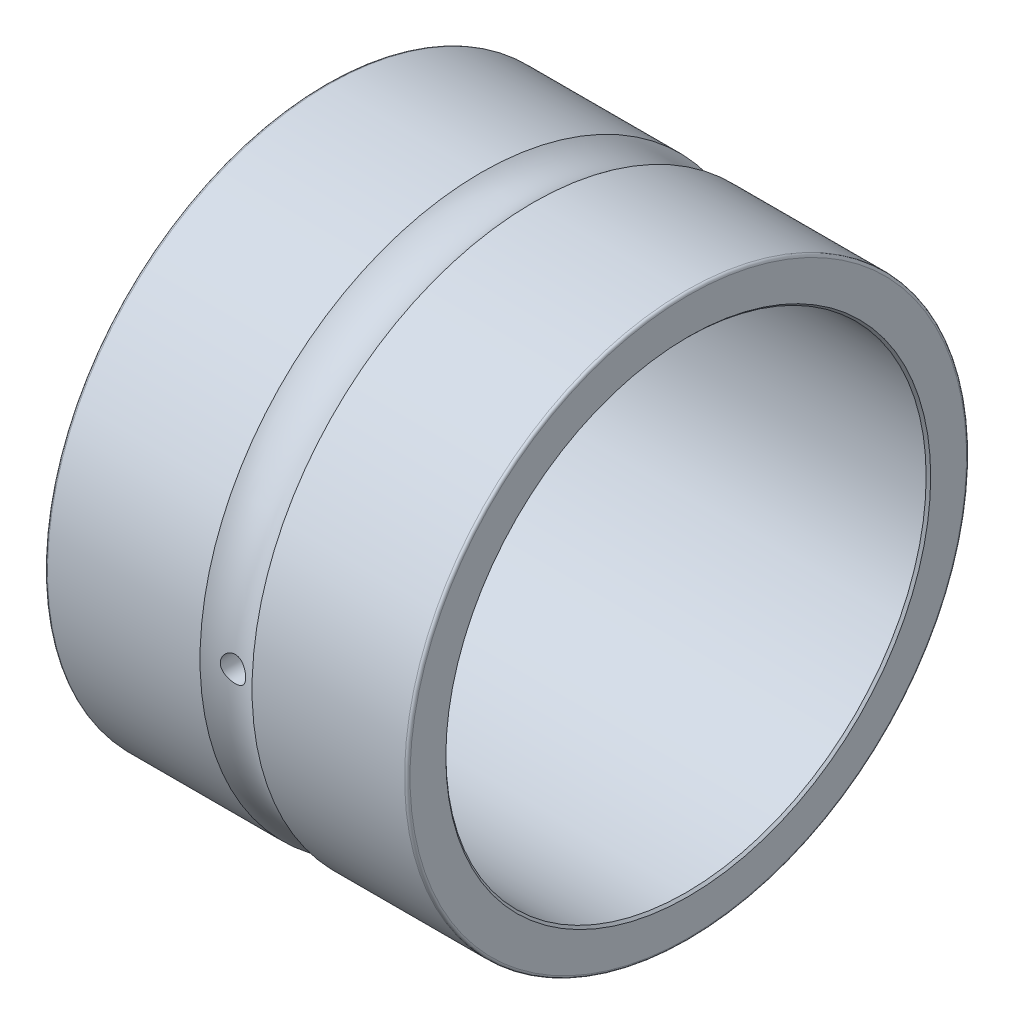
ISO-10303-21;
HEADER;
FILE_DESCRIPTION(('STEP AP214'),'2;1');
FILE_NAME('part.step','',(''),(''),'','','');
FILE_SCHEMA(('AUTOMOTIVE_DESIGN { 1 0 10303 214 1 1 1 1 }'));
ENDSEC;
DATA;
#1=APPLICATION_CONTEXT('core data for automotive mechanical design processes');
#2=APPLICATION_PROTOCOL_DEFINITION('international standard','automotive_design',2000,#1);
#3=PRODUCT_CONTEXT('',#1,'mechanical');
#4=PRODUCT('Part','Part','',(#3));
#5=PRODUCT_RELATED_PRODUCT_CATEGORY('part','',(#4));
#6=PRODUCT_DEFINITION_FORMATION('','',#4);
#7=PRODUCT_DEFINITION_CONTEXT('part definition',#1,'design');
#8=PRODUCT_DEFINITION('design','',#6,#7);
#9=PRODUCT_DEFINITION_SHAPE('','',#8);
#10=(LENGTH_UNIT() NAMED_UNIT(*) SI_UNIT(.MILLI.,.METRE.));
#11=(NAMED_UNIT(*) PLANE_ANGLE_UNIT() SI_UNIT($,.RADIAN.));
#12=(NAMED_UNIT(*) SI_UNIT($,.STERADIAN.) SOLID_ANGLE_UNIT());
#13=UNCERTAINTY_MEASURE_WITH_UNIT(LENGTH_MEASURE(1.E-05),#10,'distance_accuracy_value','');
#14=(GEOMETRIC_REPRESENTATION_CONTEXT(3) GLOBAL_UNCERTAINTY_ASSIGNED_CONTEXT((#13)) GLOBAL_UNIT_ASSIGNED_CONTEXT((#10,
#11,#12)) REPRESENTATION_CONTEXT('',''));
#15=CARTESIAN_POINT('',(0.,0.,0.));
#16=DIRECTION('',(0.,0.,1.));
#17=DIRECTION('',(1.,0.,0.));
#18=AXIS2_PLACEMENT_3D('',#15,#16,#17);
#19=CARTESIAN_POINT('',(8.71493655344964,0.,0.));
#20=DIRECTION('',(-1.,0.,0.));
#21=DIRECTION('',(0.,0.,1.));
#22=AXIS2_PLACEMENT_3D('',#19,#20,#21);
#23=CYLINDRICAL_SURFACE('',#22,31.);
#24=CARTESIAN_POINT('',(17.1298731068993,0.,0.));
#25=DIRECTION('',(1.,0.,0.));
#26=DIRECTION('',(0.,1.,0.));
#27=AXIS2_PLACEMENT_3D('',#24,#25,#26);
#28=CIRCLE('',#27,31.);
#29=CARTESIAN_POINT('',(17.1298731068993,31.,0.));
#30=VERTEX_POINT('',#29);
#31=EDGE_CURVE('E262',#30,#30,#28,.F.);
#32=ORIENTED_EDGE('',*,*,#31,.T.);
#33=EDGE_LOOP('',(#32));
#34=FACE_BOUND('',#33,.T.);
#35=CARTESIAN_POINT('',(0.300000000000002,0.,0.));
#36=DIRECTION('',(1.,0.,0.));
#37=DIRECTION('',(0.,1.,0.));
#38=AXIS2_PLACEMENT_3D('',#35,#36,#37);
#39=CIRCLE('',#38,31.);
#40=CARTESIAN_POINT('',(0.300000000000002,31.,0.));
#41=VERTEX_POINT('',#40);
#42=EDGE_CURVE('E260',#41,#41,#39,.F.);
#43=ORIENTED_EDGE('',*,*,#42,.F.);
#44=EDGE_LOOP('',(#43));
#45=FACE_BOUND('',#44,.T.);
#46=ADVANCED_FACE('F16',(#34,#45),#23,.T.);
#47=CARTESIAN_POINT('',(31.2850634465504,0.,0.));
#48=DIRECTION('',(-1.,0.,0.));
#49=DIRECTION('',(0.,0.,1.));
#50=AXIS2_PLACEMENT_3D('',#47,#48,#49);
#51=CYLINDRICAL_SURFACE('',#50,31.);
#52=CARTESIAN_POINT('',(22.8701268931007,0.,0.));
#53=DIRECTION('',(1.,0.,0.));
#54=DIRECTION('',(0.,1.,0.));
#55=AXIS2_PLACEMENT_3D('',#52,#53,#54);
#56=CIRCLE('',#55,31.);
#57=CARTESIAN_POINT('',(22.8701268931007,31.,0.));
#58=VERTEX_POINT('',#57);
#59=EDGE_CURVE('E51',#58,#58,#56,.T.);
#60=ORIENTED_EDGE('',*,*,#59,.T.);
#61=EDGE_LOOP('',(#60));
#62=FACE_BOUND('',#61,.T.);
#63=CARTESIAN_POINT('',(39.7,0.,0.));
#64=DIRECTION('',(1.,0.,0.));
#65=DIRECTION('',(0.,1.,0.));
#66=AXIS2_PLACEMENT_3D('',#63,#64,#65);
#67=CIRCLE('',#66,31.);
#68=CARTESIAN_POINT('',(39.7,31.,0.));
#69=VERTEX_POINT('',#68);
#70=EDGE_CURVE('E112',#69,#69,#67,.T.);
#71=ORIENTED_EDGE('',*,*,#70,.F.);
#72=EDGE_LOOP('',(#71));
#73=FACE_BOUND('',#72,.T.);
#74=ADVANCED_FACE('F73',(#62,#73),#51,.T.);
#75=CARTESIAN_POINT('',(39.7,0.,0.));
#76=DIRECTION('',(1.,0.,0.));
#77=DIRECTION('',(0.,1.,0.));
#78=AXIS2_PLACEMENT_3D('',#75,#76,#77);
#79=TOROIDAL_SURFACE('',#78,30.7,0.29999999999999);
#80=ORIENTED_EDGE('',*,*,#70,.T.);
#81=EDGE_LOOP('',(#80));
#82=FACE_BOUND('',#81,.T.);
#83=CARTESIAN_POINT('',(40.,0.,0.));
#84=DIRECTION('',(-1.,0.,0.));
#85=DIRECTION('',(0.,-1.,0.));
#86=AXIS2_PLACEMENT_3D('',#83,#84,#85);
#87=CIRCLE('',#86,30.7);
#88=CARTESIAN_POINT('',(40.,30.7,0.));
#89=VERTEX_POINT('',#88);
#90=CARTESIAN_POINT('',(40.,-30.7,0.));
#91=VERTEX_POINT('',#90);
#92=EDGE_CURVE('E44',#89,#91,#87,.F.);
#93=ORIENTED_EDGE('',*,*,#92,.F.);
#94=CARTESIAN_POINT('',(40.,0.,0.));
#95=DIRECTION('',(-1.,0.,0.));
#96=DIRECTION('',(0.,1.,0.));
#97=AXIS2_PLACEMENT_3D('',#94,#95,#96);
#98=CIRCLE('',#97,30.7);
#99=EDGE_CURVE('E47',#91,#89,#98,.F.);
#100=ORIENTED_EDGE('',*,*,#99,.F.);
#101=EDGE_LOOP('',(#93,#100));
#102=FACE_BOUND('',#101,.T.);
#103=ADVANCED_FACE('F55',(#82,#102),#79,.T.);
#104=CARTESIAN_POINT('',(0.300000000000002,0.,0.));
#105=DIRECTION('',(1.,0.,0.));
#106=DIRECTION('',(0.,1.,0.));
#107=AXIS2_PLACEMENT_3D('',#104,#105,#106);
#108=TOROIDAL_SURFACE('',#107,30.7,0.300000000000002);
#109=ORIENTED_EDGE('',*,*,#42,.T.);
#110=EDGE_LOOP('',(#109));
#111=FACE_BOUND('',#110,.T.);
#112=CARTESIAN_POINT('',(0.,0.,0.));
#113=DIRECTION('',(1.,0.,0.));
#114=DIRECTION('',(0.,-1.,0.));
#115=AXIS2_PLACEMENT_3D('',#112,#113,#114);
#116=CIRCLE('',#115,30.7);
#117=CARTESIAN_POINT('',(0.,30.7,0.));
#118=VERTEX_POINT('',#117);
#119=CARTESIAN_POINT('',(0.,-30.7,0.));
#120=VERTEX_POINT('',#119);
#121=EDGE_CURVE('E131',#118,#120,#116,.F.);
#122=ORIENTED_EDGE('',*,*,#121,.F.);
#123=CARTESIAN_POINT('',(0.,0.,0.));
#124=DIRECTION('',(1.,0.,0.));
#125=DIRECTION('',(0.,1.,0.));
#126=AXIS2_PLACEMENT_3D('',#123,#124,#125);
#127=CIRCLE('',#126,30.7);
#128=EDGE_CURVE('E35',#120,#118,#127,.F.);
#129=ORIENTED_EDGE('',*,*,#128,.F.);
#130=EDGE_LOOP('',(#122,#129));
#131=FACE_BOUND('',#130,.T.);
#132=ADVANCED_FACE('F72',(#111,#131),#108,.T.);
#133=CARTESIAN_POINT('',(20.,0.,0.));
#134=DIRECTION('',(1.,0.,0.));
#135=DIRECTION('',(0.,1.,0.));
#136=AXIS2_PLACEMENT_3D('',#133,#134,#135);
#137=TOROIDAL_SURFACE('',#136,34.7362,4.71135000000001);
#138=ORIENTED_EDGE('',*,*,#31,.F.);
#139=EDGE_LOOP('',(#138));
#140=FACE_BOUND('',#139,.T.);
#141=ORIENTED_EDGE('',*,*,#59,.F.);
#142=EDGE_LOOP('',(#141));
#143=FACE_BOUND('',#142,.T.);
#144=CARTESIAN_POINT('',(18.60225,0.,30.2369652028372));
#145=CARTESIAN_POINT('',(18.6022556745851,0.076023188165233,30.2369612093652));
#146=CARTESIAN_POINT('',(18.6084869291793,0.152106974418818,30.2347213899583));
#147=CARTESIAN_POINT('',(18.6269672761919,0.264457029110328,30.228223946569));
#148=CARTESIAN_POINT('',(18.6346583000316,0.301636732757743,30.2255321682765));
#149=CARTESIAN_POINT('',(18.653016705957,0.375203998520133,30.2191896634181));
#150=CARTESIAN_POINT('',(18.6636863740113,0.411590929005386,30.2155382004662));
#151=CARTESIAN_POINT('',(18.6999560478349,0.518916950549644,30.2033235447107));
#152=CARTESIAN_POINT('',(18.7298634252055,0.588301273520719,30.1934826425945));
#153=CARTESIAN_POINT('',(18.8002518375813,0.721083940473457,30.1714817907223));
#154=CARTESIAN_POINT('',(18.8407366943611,0.78448010956539,30.1593210031923));
#155=CARTESIAN_POINT('',(18.9093630452721,0.87505676385753,30.1400772687196));
#156=CARTESIAN_POINT('',(18.9340645461029,0.904979779381135,30.1333680343396));
#157=CARTESIAN_POINT('',(18.9858273287694,0.962631111094489,30.1198593190893));
#158=CARTESIAN_POINT('',(19.0128862645137,0.9903615580278,30.1130599335241));
#159=CARTESIAN_POINT('',(19.0974400370031,1.07008655054271,30.0927808056796));
#160=CARTESIAN_POINT('',(19.158310936357,1.11861355877228,30.0794203559477));
#161=CARTESIAN_POINT('',(19.289311670233,1.20624124560068,30.0541107784118));
#162=CARTESIAN_POINT('',(19.3596542016692,1.24503750708531,30.0422120753622));
#163=CARTESIAN_POINT('',(19.5063075324834,1.31010974938208,30.0216545129937));
#164=CARTESIAN_POINT('',(19.5826109986915,1.33640084029519,30.012991746398));
#165=CARTESIAN_POINT('',(19.7160388312484,1.3697912814403,30.0018361099814));
#166=CARTESIAN_POINT('',(19.7722553066958,1.38025327617248,29.9982801540867));
#167=CARTESIAN_POINT('',(19.8856365205516,1.39423446897145,29.9935096265843));
#168=CARTESIAN_POINT('',(19.942801182577,1.39775422357035,29.9922948672922));
#169=CARTESIAN_POINT('',(20.0761115499943,1.39774437991028,29.9923011248814));
#170=CARTESIAN_POINT('',(20.1522835764507,1.39149910963879,29.9944603368918));
#171=CARTESIAN_POINT('',(20.2647716354761,1.37297334773328,30.0007441415157));
#172=CARTESIAN_POINT('',(20.3019977388348,1.36526329390157,30.0033490924432));
#173=CARTESIAN_POINT('',(20.375659118542,1.34685791142985,30.0094978869297));
#174=CARTESIAN_POINT('',(20.4120937602456,1.33616027595258,30.0130424558996));
#175=CARTESIAN_POINT('',(20.5195750373881,1.29978819391621,30.0249262843592));
#176=CARTESIAN_POINT('',(20.5890655579632,1.26979008079789,30.0345315836151));
#177=CARTESIAN_POINT('',(20.7220302215506,1.19918705771397,30.0561279436086));
#178=CARTESIAN_POINT('',(20.7855022561481,1.15857844921985,30.0681198358992));
#179=CARTESIAN_POINT('',(20.8760698589633,1.08982175643422,30.0871896646633));
#180=CARTESIAN_POINT('',(20.9059320322008,1.06512437984306,30.0938445618224));
#181=CARTESIAN_POINT('',(20.9634607058828,1.01338254614792,30.107283029104));
#182=CARTESIAN_POINT('',(20.9911293375704,0.986340422053238,30.1140664661943));
#183=CARTESIAN_POINT('',(21.0706717078062,0.901855925186394,30.1343594182688));
#184=CARTESIAN_POINT('',(21.119078122907,0.841058317746927,30.1478107393599));
#185=CARTESIAN_POINT('',(21.2065650232137,0.71013800412342,30.1734559465174));
#186=CARTESIAN_POINT('',(21.2453225155928,0.639790425751888,30.1856000625633));
#187=CARTESIAN_POINT('',(21.3103215679335,0.493127758012794,30.2066674073054));
#188=CARTESIAN_POINT('',(21.336578641673,0.416820203041376,30.2155946250036));
#189=CARTESIAN_POINT('',(21.3698866984971,0.283478686442578,30.2271026813644));
#190=CARTESIAN_POINT('',(21.3803126314682,0.227359923072894,30.2307771149905));
#191=CARTESIAN_POINT('',(21.3942460937629,0.114172110617248,30.2357097639035));
#192=CARTESIAN_POINT('',(21.3977542623401,0.0571031498282356,30.2369682024461));
#193=CARTESIAN_POINT('',(21.3977443254149,-0.0760231881652264,30.2369612093652));
#194=CARTESIAN_POINT('',(21.3915130708207,-0.152106974418812,30.2347213899583));
#195=CARTESIAN_POINT('',(21.3730327238081,-0.264457029110323,30.228223946569));
#196=CARTESIAN_POINT('',(21.3653416999684,-0.301636732757738,30.2255321682765));
#197=CARTESIAN_POINT('',(21.346983294043,-0.375203998520128,30.2191896634181));
#198=CARTESIAN_POINT('',(21.3363136259887,-0.411590929005382,30.2155382004662));
#199=CARTESIAN_POINT('',(21.3000439521651,-0.51891695054964,30.2033235447107));
#200=CARTESIAN_POINT('',(21.2701365747945,-0.588301273520716,30.1934826425945));
#201=CARTESIAN_POINT('',(21.1997481624187,-0.721083940473452,30.1714817907223));
#202=CARTESIAN_POINT('',(21.1592633056389,-0.784480109565383,30.1593210031923));
#203=CARTESIAN_POINT('',(21.0906369547279,-0.875056763857523,30.1400772687196));
#204=CARTESIAN_POINT('',(21.0659354538971,-0.90497977938113,30.1333680343396));
#205=CARTESIAN_POINT('',(21.0141726712306,-0.962631111094485,30.1198593190893));
#206=CARTESIAN_POINT('',(20.9871137354863,-0.990361558027797,30.1130599335241));
#207=CARTESIAN_POINT('',(20.9025599629969,-1.07008655054271,30.0927808056796));
#208=CARTESIAN_POINT('',(20.841689063643,-1.11861355877228,30.0794203559477));
#209=CARTESIAN_POINT('',(20.710688329767,-1.20624124560068,30.0541107784117));
#210=CARTESIAN_POINT('',(20.6403457983308,-1.24503750708531,30.0422120753622));
#211=CARTESIAN_POINT('',(20.4936924675166,-1.31010974938208,30.0216545129937));
#212=CARTESIAN_POINT('',(20.4173890013085,-1.3364008402952,30.012991746398));
#213=CARTESIAN_POINT('',(20.2839611687516,-1.36979128144031,30.0018361099814));
#214=CARTESIAN_POINT('',(20.2277446933042,-1.38025327617249,29.9982801540867));
#215=CARTESIAN_POINT('',(20.1143634794484,-1.39423446897145,29.9935096265843));
#216=CARTESIAN_POINT('',(20.057198817423,-1.39775422357035,29.9922948672922));
#217=CARTESIAN_POINT('',(19.9238884500057,-1.39774437991028,29.9923011248814));
#218=CARTESIAN_POINT('',(19.8477164235493,-1.39149910963879,29.9944603368918));
#219=CARTESIAN_POINT('',(19.7352283645239,-1.37297334773328,30.0007441415157));
#220=CARTESIAN_POINT('',(19.6980022611652,-1.36526329390157,30.0033490924432));
#221=CARTESIAN_POINT('',(19.624340881458,-1.34685791142985,30.0094978869297));
#222=CARTESIAN_POINT('',(19.5879062397544,-1.33616027595258,30.0130424558996));
#223=CARTESIAN_POINT('',(19.4804249626119,-1.29978819391621,30.0249262843592));
#224=CARTESIAN_POINT('',(19.4109344420368,-1.26979008079789,30.0345315836151));
#225=CARTESIAN_POINT('',(19.2779697784494,-1.19918705771397,30.0561279436086));
#226=CARTESIAN_POINT('',(19.2144977438519,-1.15857844921984,30.0681198358992));
#227=CARTESIAN_POINT('',(19.1239301410367,-1.08982175643422,30.0871896646633));
#228=CARTESIAN_POINT('',(19.0940679677992,-1.06512437984306,30.0938445618224));
#229=CARTESIAN_POINT('',(19.0365392941172,-1.01338254614792,30.107283029104));
#230=CARTESIAN_POINT('',(19.0088706624296,-0.986340422053237,30.1140664661943));
#231=CARTESIAN_POINT('',(18.9293282921938,-0.901855925186391,30.1343594182688));
#232=CARTESIAN_POINT('',(18.880921877093,-0.841058317746923,30.1478107393599));
#233=CARTESIAN_POINT('',(18.7934349767863,-0.710138004123417,30.1734559465174));
#234=CARTESIAN_POINT('',(18.7546774844072,-0.639790425751887,30.1856000625633));
#235=CARTESIAN_POINT('',(18.6896784320665,-0.493127758012797,30.2066674073054));
#236=CARTESIAN_POINT('',(18.663421358327,-0.416820203041378,30.2155946250036));
#237=CARTESIAN_POINT('',(18.6301133015029,-0.283478686442579,30.2271026813644));
#238=CARTESIAN_POINT('',(18.6196873685318,-0.227359923072894,30.2307771149905));
#239=CARTESIAN_POINT('',(18.6057539062371,-0.114172110617245,30.2357097639035));
#240=CARTESIAN_POINT('',(18.6022457376599,-0.0571031498282303,30.2369682024461));
#241=CARTESIAN_POINT('',(18.60225,0.,30.2369652028372));
#242=B_SPLINE_CURVE_WITH_KNOTS('',3,(#144,#145,#146,#147,#148,#149,#150,#151,#152,#153,#154,
#155,#156,#157,#158,#159,#160,#161,#162,#163,#164,#165,#166,#167,#168,#169,#170,#171,#172,#173,
#174,#175,#176,#177,#178,#179,#180,#181,#182,#183,#184,#185,#186,#187,#188,#189,#190,#191,#192,
#193,#194,#195,#196,#197,#198,#199,#200,#201,#202,#203,#204,#205,#206,#207,#208,#209,#210,#211,
#212,#213,#214,#215,#216,#217,#218,#219,#220,#221,#222,#223,#224,#225,#226,#227,#228,#229,#230,
#231,#232,#233,#234,#235,#236,#237,#238,#239,#240,#241),.UNSPECIFIED.,.T.,.F.,(4,2,2,2,2,2,2,2,
2,2,2,2,2,2,2,2,2,2,2,2,2,2,2,2,2,2,2,2,2,2,2,2,2,2,2,2,2,2,2,2,2,2,2,2,2,2,2,2,4),(0.,
0.227823425221944,0.341896339063391,0.4560570402831,0.683536217063637,0.91109769883184,
1.0291120565691,1.14701028085385,1.38281122296626,1.62526182920284,1.86741873143685,
2.03884436443016,2.21025625434549,2.43834531661474,2.55254759871688,2.66683830616595,
2.8946181195885,3.12247743699291,3.24031817536362,3.35804297966365,3.59350695101307,
3.83602808612349,4.07824744806807,4.24938783084351,4.42051239821303,4.64833582343497,
4.76240873727642,4.87656943849613,5.10404861527667,5.33161009704487,5.44962445478213,
5.56752267906688,5.8033236211793,6.04577422741588,6.28793112964988,6.45935676264319,
6.63076865255852,6.85885771482777,6.97305999692992,7.08735070437898,7.31513051780154,
7.54298983520595,7.66083057357667,7.77855537787669,8.0140193492261,8.25654048433653,
8.4987598462811,8.66990022905655,8.84102479642607),.UNSPECIFIED.);
#243=CARTESIAN_POINT('',(18.60225,0.,30.2369652028372));
#244=VERTEX_POINT('',#243);
#245=EDGE_CURVE('E125',#244,#244,#242,.T.);
#246=ORIENTED_EDGE('',*,*,#245,.T.);
#247=EDGE_LOOP('',(#246));
#248=FACE_BOUND('',#247,.T.);
#249=ADVANCED_FACE('F133',(#140,#143,#248),#137,.F.);
#250=CARTESIAN_POINT('',(40.,0.,28.725));
#251=DIRECTION('',(1.,0.,0.));
#252=DIRECTION('',(0.,0.,-1.));
#253=AXIS2_PLACEMENT_3D('',#250,#251,#252);
#254=PLANE('',#253);
#255=CARTESIAN_POINT('',(40.,0.,0.));
#256=DIRECTION('',(1.,0.,0.));
#257=DIRECTION('',(0.,1.,0.));
#258=AXIS2_PLACEMENT_3D('',#255,#256,#257);
#259=CIRCLE('',#258,26.75);
#260=CARTESIAN_POINT('',(40.,26.75,0.));
#261=VERTEX_POINT('',#260);
#262=EDGE_CURVE('E130',#261,#261,#259,.F.);
#263=ORIENTED_EDGE('',*,*,#262,.T.);
#264=EDGE_LOOP('',(#263));
#265=FACE_BOUND('',#264,.T.);
#266=ORIENTED_EDGE('',*,*,#99,.T.);
#267=ORIENTED_EDGE('',*,*,#92,.T.);
#268=EDGE_LOOP('',(#266,#267));
#269=FACE_BOUND('',#268,.T.);
#270=ADVANCED_FACE('F49',(#265,#269),#254,.T.);
#271=CARTESIAN_POINT('',(0.,0.,28.725));
#272=DIRECTION('',(-1.,0.,0.));
#273=DIRECTION('',(0.,0.,1.));
#274=AXIS2_PLACEMENT_3D('',#271,#272,#273);
#275=PLANE('',#274);
#276=CARTESIAN_POINT('',(0.,0.,0.));
#277=DIRECTION('',(-1.,0.,0.));
#278=DIRECTION('',(0.,0.,1.));
#279=AXIS2_PLACEMENT_3D('',#276,#277,#278);
#280=CIRCLE('',#279,26.75);
#281=CARTESIAN_POINT('',(0.,0.,26.75));
#282=VERTEX_POINT('',#281);
#283=EDGE_CURVE('E111',#282,#282,#280,.F.);
#284=ORIENTED_EDGE('',*,*,#283,.T.);
#285=EDGE_LOOP('',(#284));
#286=FACE_BOUND('',#285,.T.);
#287=ORIENTED_EDGE('',*,*,#128,.T.);
#288=ORIENTED_EDGE('',*,*,#121,.T.);
#289=EDGE_LOOP('',(#287,#288));
#290=FACE_BOUND('',#289,.T.);
#291=ADVANCED_FACE('F119',(#286,#290),#275,.T.);
#292=CARTESIAN_POINT('',(20.,0.,15.5));
#293=DIRECTION('',(0.,0.,-1.));
#294=DIRECTION('',(-1.,0.,0.));
#295=AXIS2_PLACEMENT_3D('',#292,#293,#294);
#296=CYLINDRICAL_SURFACE('',#295,1.39775);
#297=ORIENTED_EDGE('',*,*,#245,.F.);
#298=EDGE_LOOP('',(#297));
#299=FACE_BOUND('',#298,.T.);
#300=CARTESIAN_POINT('',(18.60225,0.,26.5));
#301=CARTESIAN_POINT('',(18.6022533495152,0.0784589621668498,26.4999995221441));
#302=CARTESIAN_POINT('',(18.6088779172512,0.156969607562065,26.4996478505337));
#303=CARTESIAN_POINT('',(18.6352091399764,0.311820455203973,26.4982788628224));
#304=CARTESIAN_POINT('',(18.6549301568073,0.388158178629996,26.4972608159779));
#305=CARTESIAN_POINT('',(18.7068876690059,0.536403917538338,26.4946742773044));
#306=CARTESIAN_POINT('',(18.7391181210264,0.608314052595885,26.4931060513037));
#307=CARTESIAN_POINT('',(18.8151702153415,0.745685470382416,26.4895957039769));
#308=CARTESIAN_POINT('',(18.858989333352,0.811148153261451,26.4876536641012));
#309=CARTESIAN_POINT('',(18.9570281076653,0.933856269987213,26.4836117500787));
#310=CARTESIAN_POINT('',(19.0112577512751,0.991093720027661,26.4815117255559));
#311=CARTESIAN_POINT('',(19.1285579883042,1.09565848550635,26.4773918246552));
#312=CARTESIAN_POINT('',(19.1916289226211,1.14298541864488,26.4753719513718));
#313=CARTESIAN_POINT('',(19.3248646959857,1.22640882213509,26.4716390212977));
#314=CARTESIAN_POINT('',(19.3950335519936,1.26249888550688,26.4699261397814));
#315=CARTESIAN_POINT('',(19.5404449983111,1.32238299441347,26.4670022342182));
#316=CARTESIAN_POINT('',(19.6156875414435,1.34617715426261,26.4657912055057));
#317=CARTESIAN_POINT('',(19.7690356254026,1.38077254715373,26.4640089577308));
#318=CARTESIAN_POINT('',(19.8471384092851,1.39158596925608,26.4634371384782));
#319=CARTESIAN_POINT('',(20.0040526348306,1.3999505511301,26.4629959915391));
#320=CARTESIAN_POINT('',(20.0828640714846,1.39750180457024,26.4631266588911));
#321=CARTESIAN_POINT('',(20.2388750263503,1.37942171057587,26.4640751922816));
#322=CARTESIAN_POINT('',(20.3160760837687,1.36380360351546,26.4648923681067));
#323=CARTESIAN_POINT('',(20.4667598772331,1.31984840599779,26.4671207420972));
#324=CARTESIAN_POINT('',(20.5402425624207,1.29151114162563,26.4685319483851));
#325=CARTESIAN_POINT('',(20.6814480193355,1.22290576381259,26.4717901853124));
#326=CARTESIAN_POINT('',(20.7491676519315,1.18263120099704,26.4736374514322));
#327=CARTESIAN_POINT('',(20.876884079156,1.09130283891698,26.4775591733281));
#328=CARTESIAN_POINT('',(20.9368814665102,1.0402498677512,26.4796336116449));
#329=CARTESIAN_POINT('',(21.0475230482526,0.928749619139428,26.4837786746674));
#330=CARTESIAN_POINT('',(21.0981575686521,0.868292742707613,26.4858492932644));
#331=CARTESIAN_POINT('',(21.1885841181275,0.739697527058524,26.4897523294144));
#332=CARTESIAN_POINT('',(21.2283710374592,0.67155558909665,26.4915846344983));
#333=CARTESIAN_POINT('',(21.2959668969324,0.529501551699796,26.4948047664395));
#334=CARTESIAN_POINT('',(21.3237654563233,0.455584516739036,26.4961922078225));
#335=CARTESIAN_POINT('',(21.3664962940514,0.30422600961448,26.4983611733779));
#336=CARTESIAN_POINT('',(21.3814559358854,0.226792405290093,26.4991439858335));
#337=CARTESIAN_POINT('',(21.3924570537325,0.12405111158714,26.4997213001264));
#338=CARTESIAN_POINT('',(21.3944405030171,0.099285400099825,26.4998256113029));
#339=CARTESIAN_POINT('',(21.3970874959705,0.0496833243650311,26.4999650328037));
#340=CARTESIAN_POINT('',(21.3977510388087,0.0248469600731057,26.5000001430845));
#341=CARTESIAN_POINT('',(21.3977467227659,-0.0783871955774563,26.4999995485969));
#342=CARTESIAN_POINT('',(21.3911290208761,-0.156879848470211,26.4996482287494));
#343=CARTESIAN_POINT('',(21.3648112281334,-0.311749711634715,26.4982799046638));
#344=CARTESIAN_POINT('',(21.3450832601796,-0.388122052085859,26.4972614819934));
#345=CARTESIAN_POINT('',(21.2931087024027,-0.536412117576178,26.4946740985713));
#346=CARTESIAN_POINT('',(21.2608728775362,-0.608333611709728,26.493105611347));
#347=CARTESIAN_POINT('',(21.184817469745,-0.745704413985555,26.4895951599229));
#348=CARTESIAN_POINT('',(21.1410036499967,-0.811156919984345,26.4876533816668));
#349=CARTESIAN_POINT('',(21.0429787810295,-0.933847663433219,26.4836120272311));
#350=CARTESIAN_POINT('',(20.9887577193286,-0.991077897022933,26.4815123002868));
#351=CARTESIAN_POINT('',(20.8714587748476,-1.09564557410118,26.4773923821448));
#352=CARTESIAN_POINT('',(20.8083781301503,-1.14297992111645,26.4753722160021));
#353=CARTESIAN_POINT('',(20.6751005453309,-1.22643166833321,26.4716379803516));
#354=CARTESIAN_POINT('',(20.6048966565662,-1.26253797344126,26.4699242143221));
#355=CARTESIAN_POINT('',(20.4594635052746,-1.32241032730527,26.4670009165169));
#356=CARTESIAN_POINT('',(20.3842399278947,-1.34619007772609,26.4657908251743));
#357=CARTESIAN_POINT('',(20.2571676071629,-1.37486335026094,26.4643131934508));
#358=CARTESIAN_POINT('',(20.2061204641009,-1.38343433944286,26.4638648486463));
#359=CARTESIAN_POINT('',(20.1033896958838,-1.39487876581836,26.4632640768616));
#360=CARTESIAN_POINT('',(20.051706071184,-1.39775220708835,26.4631116496696));
#361=CARTESIAN_POINT('',(19.9215411851247,-1.39774665096318,26.4631124465919));
#362=CARTESIAN_POINT('',(19.8430306871279,-1.39112210985352,26.463464620073));
#363=CARTESIAN_POINT('',(19.6881800134794,-1.36479096277589,26.4648354015095));
#364=CARTESIAN_POINT('',(19.6118423202616,-1.34506997409717,26.4658547421399));
#365=CARTESIAN_POINT('',(19.4635954345541,-1.2931121478277,26.4684441112031));
#366=CARTESIAN_POINT('',(19.3916841942108,-1.26088114906119,26.4700138826993));
#367=CARTESIAN_POINT('',(19.2543131547342,-1.1848287828125,26.4735268275245));
#368=CARTESIAN_POINT('',(19.1888517329549,-1.14101034077242,26.4754699065721));
#369=CARTESIAN_POINT('',(19.0661515290241,-1.04297835859167,26.4795127990335));
#370=CARTESIAN_POINT('',(19.0089199673213,-0.988755786586894,26.481612747652));
#371=CARTESIAN_POINT('',(18.904352633425,-0.87145630110587,26.4857320129257));
#372=CARTESIAN_POINT('',(18.8570194632438,-0.808377066724328,26.4877513082668));
#373=CARTESIAN_POINT('',(18.7735687817226,-0.675101344414156,26.4914832256682));
#374=CARTESIAN_POINT('',(18.7374625794567,-0.604897773828641,26.4931955377698));
#375=CARTESIAN_POINT('',(18.6775900778995,-0.459464714805256,26.496115955599));
#376=CARTESIAN_POINT('',(18.6538101753239,-0.384240870704315,26.4973246168646));
#377=CARTESIAN_POINT('',(18.625136739953,-0.257168124749541,26.498800398595));
#378=CARTESIAN_POINT('',(18.6165657086556,-0.206120826453863,26.4992481453162));
#379=CARTESIAN_POINT('',(18.6051212417546,-0.103389833264705,26.4998481031259));
#380=CARTESIAN_POINT('',(18.6022477925976,-0.0517061398853632,26.5000003149173));
#381=CARTESIAN_POINT('',(18.60225,0.,26.5));
#382=B_SPLINE_CURVE_WITH_KNOTS('',3,(#300,#301,#302,#303,#304,#305,#306,#307,#308,#309,#310,
#311,#312,#313,#314,#315,#316,#317,#318,#319,#320,#321,#322,#323,#324,#325,#326,#327,#328,#329,
#330,#331,#332,#333,#334,#335,#336,#337,#338,#339,#340,#341,#342,#343,#344,#345,#346,#347,#348,
#349,#350,#351,#352,#353,#354,#355,#356,#357,#358,#359,#360,#361,#362,#363,#364,#365,#366,#367,
#368,#369,#370,#371,#372,#373,#374,#375,#376,#377,#378,#379,#380,#381),.UNSPECIFIED.,.T.,.F.,(4,
2,2,2,2,2,2,2,2,2,2,2,2,2,2,2,2,2,2,2,2,2,2,2,2,2,2,2,2,2,2,2,2,2,2,2,2,2,2,2,4),(0.,
0.235188606253858,0.470635552124098,0.705968894137905,0.941251017176076,1.17675999572102,
1.41227805738798,1.64793016063865,1.88358007300537,2.11900853389965,2.35443533200457,
2.58962571564479,2.82481931524979,3.06014021544731,3.29544304265428,3.53098764948416,
3.76664301825723,4.00250203387418,4.23785710751632,4.31236797618588,4.38687889173977,
4.6219459459385,4.85751444270936,5.09288064425495,5.32812990758055,5.56360664167856,
5.7991569477281,6.03493928073947,6.2704589632507,6.42545320678065,6.58044733941683,
6.81563550360727,7.05108238296919,7.28641950358418,7.52169726607305,7.75718020576066,
7.99272496977696,8.22850623823059,8.46402674187335,8.61902144950485,8.77401578843766),.UNSPECIFIED.);
#383=CARTESIAN_POINT('',(18.60225,0.,26.5));
#384=VERTEX_POINT('',#383);
#385=EDGE_CURVE('E104',#384,#384,#382,.T.);
#386=ORIENTED_EDGE('',*,*,#385,.T.);
#387=EDGE_LOOP('',(#386));
#388=FACE_BOUND('',#387,.T.);
#389=ADVANCED_FACE('F115',(#299,#388),#296,.F.);
#390=CARTESIAN_POINT('',(40.,0.,0.));
#391=DIRECTION('',(1.,0.,0.));
#392=DIRECTION('',(0.,1.,0.));
#393=AXIS2_PLACEMENT_3D('',#390,#391,#392);
#394=CONICAL_SURFACE('',#393,26.75,0.785398163397448);
#395=CARTESIAN_POINT('',(39.75,0.,0.));
#396=DIRECTION('',(-1.,0.,0.));
#397=DIRECTION('',(0.,0.,1.));
#398=AXIS2_PLACEMENT_3D('',#395,#396,#397);
#399=CIRCLE('',#398,26.5);
#400=CARTESIAN_POINT('',(39.75,0.,26.5));
#401=VERTEX_POINT('',#400);
#402=EDGE_CURVE('E27',#401,#401,#399,.T.);
#403=ORIENTED_EDGE('',*,*,#402,.T.);
#404=EDGE_LOOP('',(#403));
#405=FACE_BOUND('',#404,.T.);
#406=ORIENTED_EDGE('',*,*,#262,.F.);
#407=EDGE_LOOP('',(#406));
#408=FACE_BOUND('',#407,.T.);
#409=ADVANCED_FACE('F96',(#405,#408),#394,.F.);
#410=CARTESIAN_POINT('',(0.,0.,0.));
#411=DIRECTION('',(-1.,0.,0.));
#412=DIRECTION('',(0.,0.,1.));
#413=AXIS2_PLACEMENT_3D('',#410,#411,#412);
#414=CONICAL_SURFACE('',#413,26.75,0.785398163397447);
#415=ORIENTED_EDGE('',*,*,#283,.F.);
#416=EDGE_LOOP('',(#415));
#417=FACE_BOUND('',#416,.T.);
#418=CARTESIAN_POINT('',(0.25,0.,0.));
#419=DIRECTION('',(-1.,0.,0.));
#420=DIRECTION('',(0.,0.,1.));
#421=AXIS2_PLACEMENT_3D('',#418,#419,#420);
#422=CIRCLE('',#421,26.5);
#423=CARTESIAN_POINT('',(0.25,0.,26.5));
#424=VERTEX_POINT('',#423);
#425=EDGE_CURVE('E11',#424,#424,#422,.F.);
#426=ORIENTED_EDGE('',*,*,#425,.T.);
#427=EDGE_LOOP('',(#426));
#428=FACE_BOUND('',#427,.T.);
#429=ADVANCED_FACE('F90',(#417,#428),#414,.F.);
#430=CARTESIAN_POINT('',(20.,0.,0.));
#431=DIRECTION('',(-1.,0.,0.));
#432=DIRECTION('',(0.,0.,1.));
#433=AXIS2_PLACEMENT_3D('',#430,#431,#432);
#434=CYLINDRICAL_SURFACE('',#433,26.5);
#435=ORIENTED_EDGE('',*,*,#402,.F.);
#436=EDGE_LOOP('',(#435));
#437=FACE_BOUND('',#436,.T.);
#438=ORIENTED_EDGE('',*,*,#425,.F.);
#439=EDGE_LOOP('',(#438));
#440=FACE_BOUND('',#439,.T.);
#441=ORIENTED_EDGE('',*,*,#385,.F.);
#442=EDGE_LOOP('',(#441));
#443=FACE_BOUND('',#442,.T.);
#444=ADVANCED_FACE('F88',(#437,#440,#443),#434,.F.);
#445=CLOSED_SHELL('',(#46,#74,#103,#132,#249,#270,#291,#389,#409,#429,#444));
#446=MANIFOLD_SOLID_BREP('B1',#445);
#447=ADVANCED_BREP_SHAPE_REPRESENTATION('',(#18,#446),#14);
#448=SHAPE_DEFINITION_REPRESENTATION(#9,#447);
ENDSEC;
END-ISO-10303-21;
